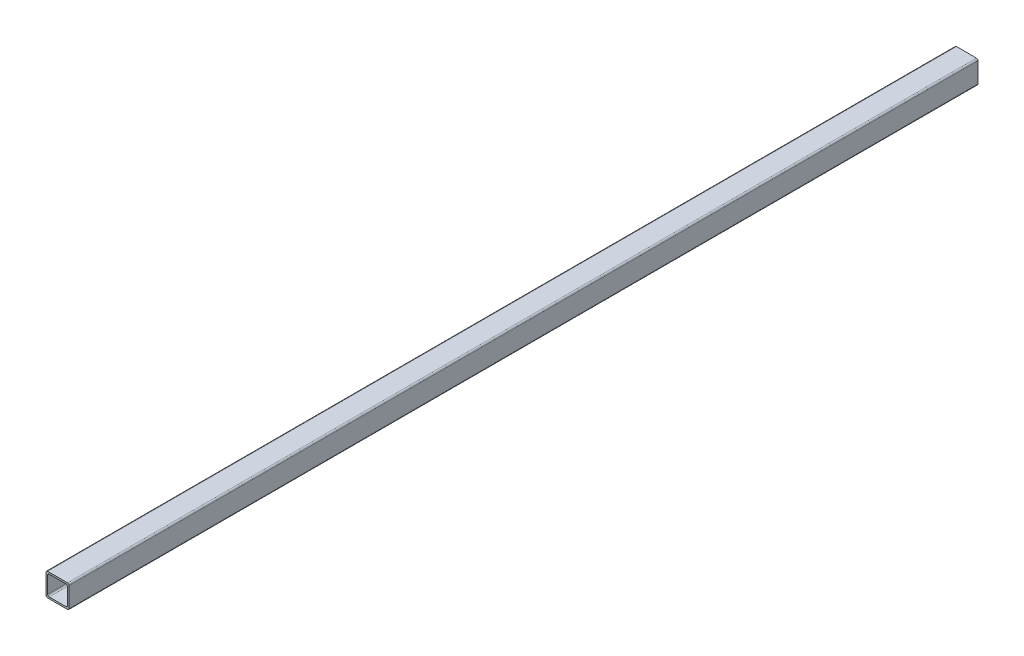
ISO-10303-21;
HEADER;
FILE_DESCRIPTION(('STEP AP214'),'2;1');
FILE_NAME('part.step','',(''),(''),'','','');
FILE_SCHEMA(('AUTOMOTIVE_DESIGN { 1 0 10303 214 1 1 1 1 }'));
ENDSEC;
DATA;
#1=APPLICATION_CONTEXT('core data for automotive mechanical design processes');
#2=APPLICATION_PROTOCOL_DEFINITION('international standard','automotive_design',2000,#1);
#3=PRODUCT_CONTEXT('',#1,'mechanical');
#4=PRODUCT('Part','Part','',(#3));
#5=PRODUCT_RELATED_PRODUCT_CATEGORY('part','',(#4));
#6=PRODUCT_DEFINITION_FORMATION('','',#4);
#7=PRODUCT_DEFINITION_CONTEXT('part definition',#1,'design');
#8=PRODUCT_DEFINITION('design','',#6,#7);
#9=PRODUCT_DEFINITION_SHAPE('','',#8);
#10=(LENGTH_UNIT() NAMED_UNIT(*) SI_UNIT(.MILLI.,.METRE.));
#11=(NAMED_UNIT(*) PLANE_ANGLE_UNIT() SI_UNIT($,.RADIAN.));
#12=(NAMED_UNIT(*) SI_UNIT($,.STERADIAN.) SOLID_ANGLE_UNIT());
#13=UNCERTAINTY_MEASURE_WITH_UNIT(LENGTH_MEASURE(1.E-05),#10,'distance_accuracy_value','');
#14=(GEOMETRIC_REPRESENTATION_CONTEXT(3) GLOBAL_UNCERTAINTY_ASSIGNED_CONTEXT((#13)) GLOBAL_UNIT_ASSIGNED_CONTEXT((#10,
#11,#12)) REPRESENTATION_CONTEXT('',''));
#15=CARTESIAN_POINT('',(0.,0.,0.));
#16=DIRECTION('',(0.,0.,1.));
#17=DIRECTION('',(1.,0.,0.));
#18=AXIS2_PLACEMENT_3D('',#15,#16,#17);
#19=CARTESIAN_POINT('',(2.54,-35.56,1500.));
#20=DIRECTION('',(0.,0.,1.));
#21=DIRECTION('',(1.,0.,0.));
#22=AXIS2_PLACEMENT_3D('',#19,#20,#21);
#23=PLANE('',#22);
#24=CARTESIAN_POINT('',(2.54,-35.56,1500.));
#25=DIRECTION('',(0.,0.,1.));
#26=DIRECTION('',(1.,0.,0.));
#27=AXIS2_PLACEMENT_3D('',#24,#25,#26);
#28=CIRCLE('',#27,2.54);
#29=CARTESIAN_POINT('',(0.,-35.56,1500.));
#30=VERTEX_POINT('',#29);
#31=CARTESIAN_POINT('',(2.54000000000002,-38.1,1500.));
#32=VERTEX_POINT('',#31);
#33=EDGE_CURVE('E211',#30,#32,#28,.T.);
#34=ORIENTED_EDGE('',*,*,#33,.T.);
#35=DIRECTION('',(1.,0.,0.));
#36=VECTOR('',#35,1.);
#37=CARTESIAN_POINT('',(2.54000000000002,-38.1,1500.));
#38=LINE('',#37,#36);
#39=CARTESIAN_POINT('',(35.56,-38.1,1500.));
#40=VERTEX_POINT('',#39);
#41=EDGE_CURVE('E214',#32,#40,#38,.T.);
#42=ORIENTED_EDGE('',*,*,#41,.T.);
#43=CARTESIAN_POINT('',(35.56,-35.56,1500.));
#44=DIRECTION('',(0.,0.,1.));
#45=DIRECTION('',(-1.,0.,0.));
#46=AXIS2_PLACEMENT_3D('',#43,#44,#45);
#47=CIRCLE('',#46,2.54);
#48=CARTESIAN_POINT('',(38.1,-35.56,1500.));
#49=VERTEX_POINT('',#48);
#50=EDGE_CURVE('E217',#40,#49,#47,.T.);
#51=ORIENTED_EDGE('',*,*,#50,.T.);
#52=DIRECTION('',(0.,1.,0.));
#53=VECTOR('',#52,1.);
#54=CARTESIAN_POINT('',(38.1,-2.54000000000002,1500.));
#55=LINE('',#54,#53);
#56=CARTESIAN_POINT('',(38.1,-2.54000000000002,1500.));
#57=VERTEX_POINT('',#56);
#58=EDGE_CURVE('E219',#49,#57,#55,.T.);
#59=ORIENTED_EDGE('',*,*,#58,.T.);
#60=CARTESIAN_POINT('',(35.56,-2.54,1500.));
#61=DIRECTION('',(0.,0.,1.));
#62=DIRECTION('',(1.,0.,0.));
#63=AXIS2_PLACEMENT_3D('',#60,#61,#62);
#64=CIRCLE('',#63,2.54);
#65=CARTESIAN_POINT('',(35.56,0.,1500.));
#66=VERTEX_POINT('',#65);
#67=EDGE_CURVE('E221',#57,#66,#64,.T.);
#68=ORIENTED_EDGE('',*,*,#67,.T.);
#69=DIRECTION('',(-1.,0.,0.));
#70=VECTOR('',#69,1.);
#71=CARTESIAN_POINT('',(2.54000000000002,0.,1500.));
#72=LINE('',#71,#70);
#73=CARTESIAN_POINT('',(2.54000000000002,0.,1500.));
#74=VERTEX_POINT('',#73);
#75=EDGE_CURVE('E223',#66,#74,#72,.T.);
#76=ORIENTED_EDGE('',*,*,#75,.T.);
#77=CARTESIAN_POINT('',(2.54,-2.54,1500.));
#78=DIRECTION('',(0.,0.,1.));
#79=DIRECTION('',(-1.,0.,0.));
#80=AXIS2_PLACEMENT_3D('',#77,#78,#79);
#81=CIRCLE('',#80,2.54);
#82=CARTESIAN_POINT('',(0.,-2.54000000000002,1500.));
#83=VERTEX_POINT('',#82);
#84=EDGE_CURVE('E225',#74,#83,#81,.T.);
#85=ORIENTED_EDGE('',*,*,#84,.T.);
#86=DIRECTION('',(0.,-1.,0.));
#87=VECTOR('',#86,1.);
#88=CARTESIAN_POINT('',(0.,-2.54000000000002,1500.));
#89=LINE('',#88,#87);
#90=EDGE_CURVE('E227',#83,#30,#89,.T.);
#91=ORIENTED_EDGE('',*,*,#90,.T.);
#92=EDGE_LOOP('',(#34,#42,#51,#59,#68,#76,#85,#91));
#93=FACE_BOUND('',#92,.T.);
#94=DIRECTION('',(1.,0.,0.));
#95=VECTOR('',#94,1.);
#96=CARTESIAN_POINT('',(5.30860000000002,-35.3314,1500.));
#97=LINE('',#96,#95);
#98=CARTESIAN_POINT('',(5.30860000000002,-35.3314,1500.));
#99=VERTEX_POINT('',#98);
#100=CARTESIAN_POINT('',(32.7914,-35.3314,1500.));
#101=VERTEX_POINT('',#100);
#102=EDGE_CURVE('E154',#99,#101,#97,.T.);
#103=ORIENTED_EDGE('',*,*,#102,.F.);
#104=CARTESIAN_POINT('',(5.3086,-32.7914,1500.));
#105=DIRECTION('',(0.,0.,1.));
#106=DIRECTION('',(1.,0.,0.));
#107=AXIS2_PLACEMENT_3D('',#104,#105,#106);
#108=CIRCLE('',#107,2.54);
#109=CARTESIAN_POINT('',(2.7686,-32.7914,1500.));
#110=VERTEX_POINT('',#109);
#111=EDGE_CURVE('E146',#110,#99,#108,.T.);
#112=ORIENTED_EDGE('',*,*,#111,.F.);
#113=DIRECTION('',(0.,-1.,0.));
#114=VECTOR('',#113,1.);
#115=CARTESIAN_POINT('',(2.7686,-5.30860000000002,1500.));
#116=LINE('',#115,#114);
#117=CARTESIAN_POINT('',(2.7686,-5.30860000000002,1500.));
#118=VERTEX_POINT('',#117);
#119=EDGE_CURVE('E179',#118,#110,#116,.T.);
#120=ORIENTED_EDGE('',*,*,#119,.F.);
#121=CARTESIAN_POINT('',(5.3086,-5.3086,1500.));
#122=DIRECTION('',(0.,0.,1.));
#123=DIRECTION('',(1.,0.,0.));
#124=AXIS2_PLACEMENT_3D('',#121,#122,#123);
#125=CIRCLE('',#124,2.54);
#126=CARTESIAN_POINT('',(5.30860000000002,-2.7686,1500.));
#127=VERTEX_POINT('',#126);
#128=EDGE_CURVE('E177',#127,#118,#125,.T.);
#129=ORIENTED_EDGE('',*,*,#128,.F.);
#130=DIRECTION('',(-1.,0.,0.));
#131=VECTOR('',#130,1.);
#132=CARTESIAN_POINT('',(5.30860000000002,-2.7686,1500.));
#133=LINE('',#132,#131);
#134=CARTESIAN_POINT('',(32.7914,-2.7686,1500.));
#135=VERTEX_POINT('',#134);
#136=EDGE_CURVE('E175',#135,#127,#133,.T.);
#137=ORIENTED_EDGE('',*,*,#136,.F.);
#138=CARTESIAN_POINT('',(32.7914,-5.3086,1500.));
#139=DIRECTION('',(0.,0.,1.));
#140=DIRECTION('',(1.,0.,0.));
#141=AXIS2_PLACEMENT_3D('',#138,#139,#140);
#142=CIRCLE('',#141,2.54);
#143=CARTESIAN_POINT('',(35.3314,-5.30860000000002,1500.));
#144=VERTEX_POINT('',#143);
#145=EDGE_CURVE('E173',#144,#135,#142,.T.);
#146=ORIENTED_EDGE('',*,*,#145,.F.);
#147=DIRECTION('',(0.,1.,0.));
#148=VECTOR('',#147,1.);
#149=CARTESIAN_POINT('',(35.3314,-5.30860000000002,1500.));
#150=LINE('',#149,#148);
#151=CARTESIAN_POINT('',(35.3314,-32.7914,1500.));
#152=VERTEX_POINT('',#151);
#153=EDGE_CURVE('E169',#152,#144,#150,.T.);
#154=ORIENTED_EDGE('',*,*,#153,.F.);
#155=CARTESIAN_POINT('',(32.7914,-32.7914,1500.));
#156=DIRECTION('',(0.,0.,1.));
#157=DIRECTION('',(1.,0.,0.));
#158=AXIS2_PLACEMENT_3D('',#155,#156,#157);
#159=CIRCLE('',#158,2.54);
#160=EDGE_CURVE('E167',#101,#152,#159,.T.);
#161=ORIENTED_EDGE('',*,*,#160,.F.);
#162=EDGE_LOOP('',(#103,#112,#120,#129,#137,#146,#154,#161));
#163=FACE_BOUND('',#162,.T.);
#164=ADVANCED_FACE('F33',(#93,#163),#23,.T.);
#165=CARTESIAN_POINT('',(2.54,-35.56,0.));
#166=DIRECTION('',(0.,0.,1.));
#167=DIRECTION('',(1.,0.,0.));
#168=AXIS2_PLACEMENT_3D('',#165,#166,#167);
#169=PLANE('',#168);
#170=CARTESIAN_POINT('',(2.54,-35.56,0.));
#171=DIRECTION('',(0.,0.,1.));
#172=DIRECTION('',(1.,0.,0.));
#173=AXIS2_PLACEMENT_3D('',#170,#171,#172);
#174=CIRCLE('',#173,2.54);
#175=CARTESIAN_POINT('',(0.,-35.56,0.));
#176=VERTEX_POINT('',#175);
#177=CARTESIAN_POINT('',(2.54000000000002,-38.1,0.));
#178=VERTEX_POINT('',#177);
#179=EDGE_CURVE('E162',#176,#178,#174,.T.);
#180=ORIENTED_EDGE('',*,*,#179,.F.);
#181=DIRECTION('',(0.,-1.,0.));
#182=VECTOR('',#181,1.);
#183=CARTESIAN_POINT('',(0.,-2.54000000000002,0.));
#184=LINE('',#183,#182);
#185=CARTESIAN_POINT('',(0.,-2.54000000000002,0.));
#186=VERTEX_POINT('',#185);
#187=EDGE_CURVE('E215',#186,#176,#184,.T.);
#188=ORIENTED_EDGE('',*,*,#187,.F.);
#189=CARTESIAN_POINT('',(2.54,-2.54,0.));
#190=DIRECTION('',(0.,0.,1.));
#191=DIRECTION('',(-1.,0.,0.));
#192=AXIS2_PLACEMENT_3D('',#189,#190,#191);
#193=CIRCLE('',#192,2.54);
#194=CARTESIAN_POINT('',(2.54000000000002,0.,0.));
#195=VERTEX_POINT('',#194);
#196=EDGE_CURVE('E242',#195,#186,#193,.T.);
#197=ORIENTED_EDGE('',*,*,#196,.F.);
#198=DIRECTION('',(-1.,0.,0.));
#199=VECTOR('',#198,1.);
#200=CARTESIAN_POINT('',(2.54000000000002,0.,0.));
#201=LINE('',#200,#199);
#202=CARTESIAN_POINT('',(35.56,0.,0.));
#203=VERTEX_POINT('',#202);
#204=EDGE_CURVE('E240',#203,#195,#201,.T.);
#205=ORIENTED_EDGE('',*,*,#204,.F.);
#206=CARTESIAN_POINT('',(35.56,-2.54,0.));
#207=DIRECTION('',(0.,0.,1.));
#208=DIRECTION('',(1.,0.,0.));
#209=AXIS2_PLACEMENT_3D('',#206,#207,#208);
#210=CIRCLE('',#209,2.54);
#211=CARTESIAN_POINT('',(38.1,-2.54000000000002,0.));
#212=VERTEX_POINT('',#211);
#213=EDGE_CURVE('E238',#212,#203,#210,.T.);
#214=ORIENTED_EDGE('',*,*,#213,.F.);
#215=DIRECTION('',(0.,1.,0.));
#216=VECTOR('',#215,1.);
#217=CARTESIAN_POINT('',(38.1,-2.54000000000002,0.));
#218=LINE('',#217,#216);
#219=CARTESIAN_POINT('',(38.1,-35.56,0.));
#220=VERTEX_POINT('',#219);
#221=EDGE_CURVE('E236',#220,#212,#218,.T.);
#222=ORIENTED_EDGE('',*,*,#221,.F.);
#223=CARTESIAN_POINT('',(35.56,-35.56,0.));
#224=DIRECTION('',(0.,0.,1.));
#225=DIRECTION('',(-1.,0.,0.));
#226=AXIS2_PLACEMENT_3D('',#223,#224,#225);
#227=CIRCLE('',#226,2.54);
#228=CARTESIAN_POINT('',(35.56,-38.1,0.));
#229=VERTEX_POINT('',#228);
#230=EDGE_CURVE('E234',#229,#220,#227,.T.);
#231=ORIENTED_EDGE('',*,*,#230,.F.);
#232=DIRECTION('',(1.,0.,0.));
#233=VECTOR('',#232,1.);
#234=CARTESIAN_POINT('',(2.54000000000002,-38.1,0.));
#235=LINE('',#234,#233);
#236=EDGE_CURVE('E232',#178,#229,#235,.T.);
#237=ORIENTED_EDGE('',*,*,#236,.F.);
#238=EDGE_LOOP('',(#180,#188,#197,#205,#214,#222,#231,#237));
#239=FACE_BOUND('',#238,.T.);
#240=CARTESIAN_POINT('',(5.3086,-32.7914,0.));
#241=DIRECTION('',(0.,0.,1.));
#242=DIRECTION('',(1.,0.,0.));
#243=AXIS2_PLACEMENT_3D('',#240,#241,#242);
#244=CIRCLE('',#243,2.54);
#245=CARTESIAN_POINT('',(2.7686,-32.7914,0.));
#246=VERTEX_POINT('',#245);
#247=CARTESIAN_POINT('',(5.30860000000002,-35.3314,0.));
#248=VERTEX_POINT('',#247);
#249=EDGE_CURVE('E56',#246,#248,#244,.T.);
#250=ORIENTED_EDGE('',*,*,#249,.T.);
#251=DIRECTION('',(1.,0.,0.));
#252=VECTOR('',#251,1.);
#253=CARTESIAN_POINT('',(5.30860000000002,-35.3314,0.));
#254=LINE('',#253,#252);
#255=CARTESIAN_POINT('',(32.7914,-35.3314,0.));
#256=VERTEX_POINT('',#255);
#257=EDGE_CURVE('E161',#248,#256,#254,.T.);
#258=ORIENTED_EDGE('',*,*,#257,.T.);
#259=CARTESIAN_POINT('',(32.7914,-32.7914,0.));
#260=DIRECTION('',(0.,0.,1.));
#261=DIRECTION('',(1.,0.,0.));
#262=AXIS2_PLACEMENT_3D('',#259,#260,#261);
#263=CIRCLE('',#262,2.54);
#264=CARTESIAN_POINT('',(35.3314,-32.7914,0.));
#265=VERTEX_POINT('',#264);
#266=EDGE_CURVE('E183',#256,#265,#263,.T.);
#267=ORIENTED_EDGE('',*,*,#266,.T.);
#268=DIRECTION('',(0.,1.,0.));
#269=VECTOR('',#268,1.);
#270=CARTESIAN_POINT('',(35.3314,-5.30860000000002,0.));
#271=LINE('',#270,#269);
#272=CARTESIAN_POINT('',(35.3314,-5.30860000000002,0.));
#273=VERTEX_POINT('',#272);
#274=EDGE_CURVE('E186',#265,#273,#271,.T.);
#275=ORIENTED_EDGE('',*,*,#274,.T.);
#276=CARTESIAN_POINT('',(32.7914,-5.3086,0.));
#277=DIRECTION('',(0.,0.,1.));
#278=DIRECTION('',(1.,0.,0.));
#279=AXIS2_PLACEMENT_3D('',#276,#277,#278);
#280=CIRCLE('',#279,2.54);
#281=CARTESIAN_POINT('',(32.7914,-2.7686,0.));
#282=VERTEX_POINT('',#281);
#283=EDGE_CURVE('E189',#273,#282,#280,.T.);
#284=ORIENTED_EDGE('',*,*,#283,.T.);
#285=DIRECTION('',(-1.,0.,0.));
#286=VECTOR('',#285,1.);
#287=CARTESIAN_POINT('',(5.30860000000002,-2.7686,0.));
#288=LINE('',#287,#286);
#289=CARTESIAN_POINT('',(5.30860000000002,-2.7686,0.));
#290=VERTEX_POINT('',#289);
#291=EDGE_CURVE('E192',#282,#290,#288,.T.);
#292=ORIENTED_EDGE('',*,*,#291,.T.);
#293=CARTESIAN_POINT('',(5.3086,-5.3086,0.));
#294=DIRECTION('',(0.,0.,1.));
#295=DIRECTION('',(1.,0.,0.));
#296=AXIS2_PLACEMENT_3D('',#293,#294,#295);
#297=CIRCLE('',#296,2.54);
#298=CARTESIAN_POINT('',(2.7686,-5.30860000000002,0.));
#299=VERTEX_POINT('',#298);
#300=EDGE_CURVE('E195',#290,#299,#297,.T.);
#301=ORIENTED_EDGE('',*,*,#300,.T.);
#302=DIRECTION('',(0.,-1.,0.));
#303=VECTOR('',#302,1.);
#304=CARTESIAN_POINT('',(2.7686,-5.30860000000002,0.));
#305=LINE('',#304,#303);
#306=EDGE_CURVE('E155',#299,#246,#305,.T.);
#307=ORIENTED_EDGE('',*,*,#306,.T.);
#308=EDGE_LOOP('',(#250,#258,#267,#275,#284,#292,#301,#307));
#309=FACE_BOUND('',#308,.T.);
#310=ADVANCED_FACE('F272',(#239,#309),#169,.F.);
#311=CARTESIAN_POINT('',(2.54,-35.56,1500.));
#312=DIRECTION('',(0.,0.,-1.));
#313=DIRECTION('',(-1.,0.,0.));
#314=AXIS2_PLACEMENT_3D('',#311,#312,#313);
#315=CYLINDRICAL_SURFACE('',#314,2.54);
#316=ORIENTED_EDGE('',*,*,#179,.T.);
#317=DIRECTION('',(0.,0.,-1.));
#318=VECTOR('',#317,1.);
#319=CARTESIAN_POINT('',(2.54000000000002,-38.1,1500.));
#320=LINE('',#319,#318);
#321=EDGE_CURVE('E11',#32,#178,#320,.T.);
#322=ORIENTED_EDGE('',*,*,#321,.F.);
#323=ORIENTED_EDGE('',*,*,#33,.F.);
#324=DIRECTION('',(0.,0.,-1.));
#325=VECTOR('',#324,1.);
#326=CARTESIAN_POINT('',(0.,-35.56,1500.));
#327=LINE('',#326,#325);
#328=EDGE_CURVE('E229',#30,#176,#327,.T.);
#329=ORIENTED_EDGE('',*,*,#328,.T.);
#330=EDGE_LOOP('',(#316,#322,#323,#329));
#331=FACE_BOUND('',#330,.T.);
#332=ADVANCED_FACE('F35',(#331),#315,.T.);
#333=CARTESIAN_POINT('',(2.54000000000002,-38.1,1500.));
#334=DIRECTION('',(0.,1.,0.));
#335=DIRECTION('',(0.,0.,1.));
#336=AXIS2_PLACEMENT_3D('',#333,#334,#335);
#337=PLANE('',#336);
#338=ORIENTED_EDGE('',*,*,#236,.T.);
#339=DIRECTION('',(0.,0.,-1.));
#340=VECTOR('',#339,1.);
#341=CARTESIAN_POINT('',(35.56,-38.1,1500.));
#342=LINE('',#341,#340);
#343=EDGE_CURVE('E41',#40,#229,#342,.T.);
#344=ORIENTED_EDGE('',*,*,#343,.F.);
#345=ORIENTED_EDGE('',*,*,#41,.F.);
#346=ORIENTED_EDGE('',*,*,#321,.T.);
#347=EDGE_LOOP('',(#338,#344,#345,#346));
#348=FACE_BOUND('',#347,.T.);
#349=ADVANCED_FACE('F289',(#348),#337,.F.);
#350=CARTESIAN_POINT('',(35.56,-35.56,1500.));
#351=DIRECTION('',(0.,0.,-1.));
#352=DIRECTION('',(-1.,0.,0.));
#353=AXIS2_PLACEMENT_3D('',#350,#351,#352);
#354=CYLINDRICAL_SURFACE('',#353,2.54);
#355=ORIENTED_EDGE('',*,*,#230,.T.);
#356=DIRECTION('',(0.,0.,-1.));
#357=VECTOR('',#356,1.);
#358=CARTESIAN_POINT('',(38.1,-35.56,1500.));
#359=LINE('',#358,#357);
#360=EDGE_CURVE('E259',#49,#220,#359,.T.);
#361=ORIENTED_EDGE('',*,*,#360,.F.);
#362=ORIENTED_EDGE('',*,*,#50,.F.);
#363=ORIENTED_EDGE('',*,*,#343,.T.);
#364=EDGE_LOOP('',(#355,#361,#362,#363));
#365=FACE_BOUND('',#364,.T.);
#366=ADVANCED_FACE('F266',(#365),#354,.T.);
#367=CARTESIAN_POINT('',(38.1,-2.54000000000002,1500.));
#368=DIRECTION('',(-1.,0.,0.));
#369=DIRECTION('',(0.,-1.,0.));
#370=AXIS2_PLACEMENT_3D('',#367,#368,#369);
#371=PLANE('',#370);
#372=ORIENTED_EDGE('',*,*,#221,.T.);
#373=DIRECTION('',(0.,0.,-1.));
#374=VECTOR('',#373,1.);
#375=CARTESIAN_POINT('',(38.1,-2.54000000000002,1500.));
#376=LINE('',#375,#374);
#377=EDGE_CURVE('E256',#57,#212,#376,.T.);
#378=ORIENTED_EDGE('',*,*,#377,.F.);
#379=ORIENTED_EDGE('',*,*,#58,.F.);
#380=ORIENTED_EDGE('',*,*,#360,.T.);
#381=EDGE_LOOP('',(#372,#378,#379,#380));
#382=FACE_BOUND('',#381,.T.);
#383=ADVANCED_FACE('F278',(#382),#371,.F.);
#384=CARTESIAN_POINT('',(35.56,-2.54,1500.));
#385=DIRECTION('',(0.,0.,-1.));
#386=DIRECTION('',(-1.,0.,0.));
#387=AXIS2_PLACEMENT_3D('',#384,#385,#386);
#388=CYLINDRICAL_SURFACE('',#387,2.54);
#389=ORIENTED_EDGE('',*,*,#213,.T.);
#390=DIRECTION('',(0.,0.,-1.));
#391=VECTOR('',#390,1.);
#392=CARTESIAN_POINT('',(35.56,0.,1500.));
#393=LINE('',#392,#391);
#394=EDGE_CURVE('E253',#66,#203,#393,.T.);
#395=ORIENTED_EDGE('',*,*,#394,.F.);
#396=ORIENTED_EDGE('',*,*,#67,.F.);
#397=ORIENTED_EDGE('',*,*,#377,.T.);
#398=EDGE_LOOP('',(#389,#395,#396,#397));
#399=FACE_BOUND('',#398,.T.);
#400=ADVANCED_FACE('F282',(#399),#388,.T.);
#401=CARTESIAN_POINT('',(2.54000000000002,0.,1500.));
#402=DIRECTION('',(0.,-1.,0.));
#403=DIRECTION('',(0.,0.,-1.));
#404=AXIS2_PLACEMENT_3D('',#401,#402,#403);
#405=PLANE('',#404);
#406=ORIENTED_EDGE('',*,*,#204,.T.);
#407=DIRECTION('',(0.,0.,-1.));
#408=VECTOR('',#407,1.);
#409=CARTESIAN_POINT('',(2.54000000000002,0.,1500.));
#410=LINE('',#409,#408);
#411=EDGE_CURVE('E250',#74,#195,#410,.T.);
#412=ORIENTED_EDGE('',*,*,#411,.F.);
#413=ORIENTED_EDGE('',*,*,#75,.F.);
#414=ORIENTED_EDGE('',*,*,#394,.T.);
#415=EDGE_LOOP('',(#406,#412,#413,#414));
#416=FACE_BOUND('',#415,.T.);
#417=ADVANCED_FACE('F302',(#416),#405,.F.);
#418=CARTESIAN_POINT('',(2.54,-2.54,1500.));
#419=DIRECTION('',(0.,0.,-1.));
#420=DIRECTION('',(-1.,0.,0.));
#421=AXIS2_PLACEMENT_3D('',#418,#419,#420);
#422=CYLINDRICAL_SURFACE('',#421,2.54);
#423=ORIENTED_EDGE('',*,*,#196,.T.);
#424=DIRECTION('',(0.,0.,-1.));
#425=VECTOR('',#424,1.);
#426=CARTESIAN_POINT('',(0.,-2.54000000000002,1500.));
#427=LINE('',#426,#425);
#428=EDGE_CURVE('E247',#83,#186,#427,.T.);
#429=ORIENTED_EDGE('',*,*,#428,.F.);
#430=ORIENTED_EDGE('',*,*,#84,.F.);
#431=ORIENTED_EDGE('',*,*,#411,.T.);
#432=EDGE_LOOP('',(#423,#429,#430,#431));
#433=FACE_BOUND('',#432,.T.);
#434=ADVANCED_FACE('F300',(#433),#422,.T.);
#435=CARTESIAN_POINT('',(0.,-2.54000000000002,1500.));
#436=DIRECTION('',(1.,0.,0.));
#437=DIRECTION('',(0.,1.,0.));
#438=AXIS2_PLACEMENT_3D('',#435,#436,#437);
#439=PLANE('',#438);
#440=ORIENTED_EDGE('',*,*,#187,.T.);
#441=ORIENTED_EDGE('',*,*,#328,.F.);
#442=ORIENTED_EDGE('',*,*,#90,.F.);
#443=ORIENTED_EDGE('',*,*,#428,.T.);
#444=EDGE_LOOP('',(#440,#441,#442,#443));
#445=FACE_BOUND('',#444,.T.);
#446=ADVANCED_FACE('F295',(#445),#439,.F.);
#447=CARTESIAN_POINT('',(5.3086,-32.7914,1500.));
#448=DIRECTION('',(0.,0.,-1.));
#449=DIRECTION('',(-1.,0.,0.));
#450=AXIS2_PLACEMENT_3D('',#447,#448,#449);
#451=CYLINDRICAL_SURFACE('',#450,2.54);
#452=ORIENTED_EDGE('',*,*,#249,.F.);
#453=DIRECTION('',(0.,0.,-1.));
#454=VECTOR('',#453,1.);
#455=CARTESIAN_POINT('',(2.7686,-32.7914,1500.));
#456=LINE('',#455,#454);
#457=EDGE_CURVE('E150',#110,#246,#456,.T.);
#458=ORIENTED_EDGE('',*,*,#457,.F.);
#459=ORIENTED_EDGE('',*,*,#111,.T.);
#460=DIRECTION('',(0.,0.,-1.));
#461=VECTOR('',#460,1.);
#462=CARTESIAN_POINT('',(5.30860000000002,-35.3314,1500.));
#463=LINE('',#462,#461);
#464=EDGE_CURVE('E149',#99,#248,#463,.T.);
#465=ORIENTED_EDGE('',*,*,#464,.T.);
#466=EDGE_LOOP('',(#452,#458,#459,#465));
#467=FACE_BOUND('',#466,.T.);
#468=ADVANCED_FACE('F148',(#467),#451,.F.);
#469=CARTESIAN_POINT('',(5.30860000000002,-35.3314,1500.));
#470=DIRECTION('',(0.,1.,0.));
#471=DIRECTION('',(0.,0.,1.));
#472=AXIS2_PLACEMENT_3D('',#469,#470,#471);
#473=PLANE('',#472);
#474=ORIENTED_EDGE('',*,*,#257,.F.);
#475=ORIENTED_EDGE('',*,*,#464,.F.);
#476=ORIENTED_EDGE('',*,*,#102,.T.);
#477=DIRECTION('',(0.,0.,-1.));
#478=VECTOR('',#477,1.);
#479=CARTESIAN_POINT('',(32.7914,-35.3314,1500.));
#480=LINE('',#479,#478);
#481=EDGE_CURVE('E163',#101,#256,#480,.T.);
#482=ORIENTED_EDGE('',*,*,#481,.T.);
#483=EDGE_LOOP('',(#474,#475,#476,#482));
#484=FACE_BOUND('',#483,.T.);
#485=ADVANCED_FACE('F158',(#484),#473,.T.);
#486=CARTESIAN_POINT('',(32.7914,-32.7914,1500.));
#487=DIRECTION('',(0.,0.,-1.));
#488=DIRECTION('',(-1.,0.,0.));
#489=AXIS2_PLACEMENT_3D('',#486,#487,#488);
#490=CYLINDRICAL_SURFACE('',#489,2.54);
#491=ORIENTED_EDGE('',*,*,#266,.F.);
#492=ORIENTED_EDGE('',*,*,#481,.F.);
#493=ORIENTED_EDGE('',*,*,#160,.T.);
#494=DIRECTION('',(0.,0.,-1.));
#495=VECTOR('',#494,1.);
#496=CARTESIAN_POINT('',(35.3314,-32.7914,1500.));
#497=LINE('',#496,#495);
#498=EDGE_CURVE('E208',#152,#265,#497,.T.);
#499=ORIENTED_EDGE('',*,*,#498,.T.);
#500=EDGE_LOOP('',(#491,#492,#493,#499));
#501=FACE_BOUND('',#500,.T.);
#502=ADVANCED_FACE('F327',(#501),#490,.F.);
#503=CARTESIAN_POINT('',(35.3314,-5.30860000000002,1500.));
#504=DIRECTION('',(-1.,0.,0.));
#505=DIRECTION('',(0.,0.,1.));
#506=AXIS2_PLACEMENT_3D('',#503,#504,#505);
#507=PLANE('',#506);
#508=ORIENTED_EDGE('',*,*,#274,.F.);
#509=ORIENTED_EDGE('',*,*,#498,.F.);
#510=ORIENTED_EDGE('',*,*,#153,.T.);
#511=DIRECTION('',(0.,0.,-1.));
#512=VECTOR('',#511,1.);
#513=CARTESIAN_POINT('',(35.3314,-5.30860000000002,1500.));
#514=LINE('',#513,#512);
#515=EDGE_CURVE('E206',#144,#273,#514,.T.);
#516=ORIENTED_EDGE('',*,*,#515,.T.);
#517=EDGE_LOOP('',(#508,#509,#510,#516));
#518=FACE_BOUND('',#517,.T.);
#519=ADVANCED_FACE('F331',(#518),#507,.T.);
#520=CARTESIAN_POINT('',(32.7914,-5.3086,1500.));
#521=DIRECTION('',(0.,0.,-1.));
#522=DIRECTION('',(-1.,0.,0.));
#523=AXIS2_PLACEMENT_3D('',#520,#521,#522);
#524=CYLINDRICAL_SURFACE('',#523,2.54);
#525=ORIENTED_EDGE('',*,*,#283,.F.);
#526=ORIENTED_EDGE('',*,*,#515,.F.);
#527=ORIENTED_EDGE('',*,*,#145,.T.);
#528=DIRECTION('',(0.,0.,-1.));
#529=VECTOR('',#528,1.);
#530=CARTESIAN_POINT('',(32.7914,-2.7686,1500.));
#531=LINE('',#530,#529);
#532=EDGE_CURVE('E204',#135,#282,#531,.T.);
#533=ORIENTED_EDGE('',*,*,#532,.T.);
#534=EDGE_LOOP('',(#525,#526,#527,#533));
#535=FACE_BOUND('',#534,.T.);
#536=ADVANCED_FACE('F337',(#535),#524,.F.);
#537=CARTESIAN_POINT('',(5.30860000000002,-2.7686,1500.));
#538=DIRECTION('',(0.,-1.,0.));
#539=DIRECTION('',(0.,0.,-1.));
#540=AXIS2_PLACEMENT_3D('',#537,#538,#539);
#541=PLANE('',#540);
#542=ORIENTED_EDGE('',*,*,#291,.F.);
#543=ORIENTED_EDGE('',*,*,#532,.F.);
#544=ORIENTED_EDGE('',*,*,#136,.T.);
#545=DIRECTION('',(0.,0.,-1.));
#546=VECTOR('',#545,1.);
#547=CARTESIAN_POINT('',(5.30860000000002,-2.7686,1500.));
#548=LINE('',#547,#546);
#549=EDGE_CURVE('E202',#127,#290,#548,.T.);
#550=ORIENTED_EDGE('',*,*,#549,.T.);
#551=EDGE_LOOP('',(#542,#543,#544,#550));
#552=FACE_BOUND('',#551,.T.);
#553=ADVANCED_FACE('F341',(#552),#541,.T.);
#554=CARTESIAN_POINT('',(5.3086,-5.3086,1500.));
#555=DIRECTION('',(0.,0.,-1.));
#556=DIRECTION('',(-1.,0.,0.));
#557=AXIS2_PLACEMENT_3D('',#554,#555,#556);
#558=CYLINDRICAL_SURFACE('',#557,2.54);
#559=ORIENTED_EDGE('',*,*,#300,.F.);
#560=ORIENTED_EDGE('',*,*,#549,.F.);
#561=ORIENTED_EDGE('',*,*,#128,.T.);
#562=DIRECTION('',(0.,0.,-1.));
#563=VECTOR('',#562,1.);
#564=CARTESIAN_POINT('',(2.7686,-5.30860000000002,1500.));
#565=LINE('',#564,#563);
#566=EDGE_CURVE('E48',#118,#299,#565,.T.);
#567=ORIENTED_EDGE('',*,*,#566,.T.);
#568=EDGE_LOOP('',(#559,#560,#561,#567));
#569=FACE_BOUND('',#568,.T.);
#570=ADVANCED_FACE('F345',(#569),#558,.F.);
#571=CARTESIAN_POINT('',(2.7686,-5.30860000000002,1500.));
#572=DIRECTION('',(1.,0.,0.));
#573=DIRECTION('',(0.,0.,-1.));
#574=AXIS2_PLACEMENT_3D('',#571,#572,#573);
#575=PLANE('',#574);
#576=ORIENTED_EDGE('',*,*,#306,.F.);
#577=ORIENTED_EDGE('',*,*,#566,.F.);
#578=ORIENTED_EDGE('',*,*,#119,.T.);
#579=ORIENTED_EDGE('',*,*,#457,.T.);
#580=EDGE_LOOP('',(#576,#577,#578,#579));
#581=FACE_BOUND('',#580,.T.);
#582=ADVANCED_FACE('F349',(#581),#575,.T.);
#583=CLOSED_SHELL('',(#164,#310,#332,#349,#366,#383,#400,#417,#434,#446,#468,#485,#502,#519,
#536,#553,#570,#582));
#584=MANIFOLD_SOLID_BREP('B2',#583);
#585=ADVANCED_BREP_SHAPE_REPRESENTATION('',(#18,#584),#14);
#586=SHAPE_DEFINITION_REPRESENTATION(#9,#585);
ENDSEC;
END-ISO-10303-21;
